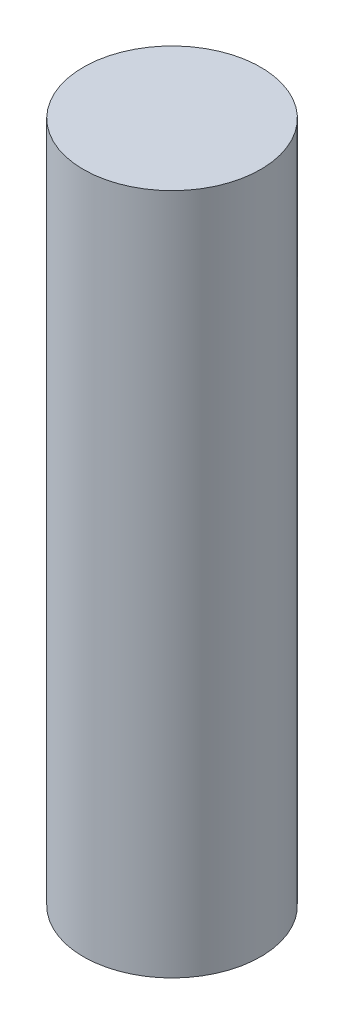
ISO-10303-21;
HEADER;
FILE_DESCRIPTION(('STEP AP214'),'2;1');
FILE_NAME('part.step','',(''),(''),'','','');
FILE_SCHEMA(('AUTOMOTIVE_DESIGN { 1 0 10303 214 1 1 1 1 }'));
ENDSEC;
DATA;
#1=APPLICATION_CONTEXT('core data for automotive mechanical design processes');
#2=APPLICATION_PROTOCOL_DEFINITION('international standard','automotive_design',2000,#1);
#3=PRODUCT_CONTEXT('',#1,'mechanical');
#4=PRODUCT('Part','Part','',(#3));
#5=PRODUCT_RELATED_PRODUCT_CATEGORY('part','',(#4));
#6=PRODUCT_DEFINITION_FORMATION('','',#4);
#7=PRODUCT_DEFINITION_CONTEXT('part definition',#1,'design');
#8=PRODUCT_DEFINITION('design','',#6,#7);
#9=PRODUCT_DEFINITION_SHAPE('','',#8);
#10=(LENGTH_UNIT() NAMED_UNIT(*) SI_UNIT(.MILLI.,.METRE.));
#11=(NAMED_UNIT(*) PLANE_ANGLE_UNIT() SI_UNIT($,.RADIAN.));
#12=(NAMED_UNIT(*) SI_UNIT($,.STERADIAN.) SOLID_ANGLE_UNIT());
#13=UNCERTAINTY_MEASURE_WITH_UNIT(LENGTH_MEASURE(1.E-05),#10,'distance_accuracy_value','');
#14=(GEOMETRIC_REPRESENTATION_CONTEXT(3) GLOBAL_UNCERTAINTY_ASSIGNED_CONTEXT((#13)) GLOBAL_UNIT_ASSIGNED_CONTEXT((#10,
#11,#12)) REPRESENTATION_CONTEXT('',''));
#15=CARTESIAN_POINT('',(0.,0.,0.));
#16=DIRECTION('',(0.,0.,1.));
#17=DIRECTION('',(1.,0.,0.));
#18=AXIS2_PLACEMENT_3D('',#15,#16,#17);
#19=CARTESIAN_POINT('',(0.,20.,0.));
#20=DIRECTION('',(0.,-1.,0.));
#21=DIRECTION('',(0.,0.,-1.));
#22=AXIS2_PLACEMENT_3D('',#19,#20,#21);
#23=CYLINDRICAL_SURFACE('',#22,2.6);
#24=CARTESIAN_POINT('',(0.,20.,0.));
#25=DIRECTION('',(0.,1.,0.));
#26=DIRECTION('',(0.,0.,1.));
#27=AXIS2_PLACEMENT_3D('',#24,#25,#26);
#28=CIRCLE('',#27,2.6);
#29=CARTESIAN_POINT('',(0.,20.,2.6));
#30=VERTEX_POINT('',#29);
#31=EDGE_CURVE('E10',#30,#30,#28,.T.);
#32=ORIENTED_EDGE('',*,*,#31,.F.);
#33=EDGE_LOOP('',(#32));
#34=FACE_BOUND('',#33,.T.);
#35=CARTESIAN_POINT('',(0.,0.,0.));
#36=DIRECTION('',(0.,1.,0.));
#37=DIRECTION('',(0.,0.,1.));
#38=AXIS2_PLACEMENT_3D('',#35,#36,#37);
#39=CIRCLE('',#38,2.6);
#40=CARTESIAN_POINT('',(0.,0.,2.6));
#41=VERTEX_POINT('',#40);
#42=EDGE_CURVE('E33',#41,#41,#39,.T.);
#43=ORIENTED_EDGE('',*,*,#42,.T.);
#44=EDGE_LOOP('',(#43));
#45=FACE_BOUND('',#44,.T.);
#46=ADVANCED_FACE('F30',(#34,#45),#23,.T.);
#47=CARTESIAN_POINT('',(0.,20.,0.));
#48=DIRECTION('',(0.,1.,0.));
#49=DIRECTION('',(0.,0.,1.));
#50=AXIS2_PLACEMENT_3D('',#47,#48,#49);
#51=PLANE('',#50);
#52=ORIENTED_EDGE('',*,*,#31,.T.);
#53=EDGE_LOOP('',(#52));
#54=FACE_BOUND('',#53,.T.);
#55=ADVANCED_FACE('F45',(#54),#51,.T.);
#56=CARTESIAN_POINT('',(0.,0.,0.));
#57=DIRECTION('',(0.,1.,0.));
#58=DIRECTION('',(0.,0.,1.));
#59=AXIS2_PLACEMENT_3D('',#56,#57,#58);
#60=PLANE('',#59);
#61=ORIENTED_EDGE('',*,*,#42,.F.);
#62=EDGE_LOOP('',(#61));
#63=FACE_BOUND('',#62,.T.);
#64=ADVANCED_FACE('F43',(#63),#60,.F.);
#65=CLOSED_SHELL('',(#46,#55,#64));
#66=MANIFOLD_SOLID_BREP('B2',#65);
#67=ADVANCED_BREP_SHAPE_REPRESENTATION('',(#18,#66),#14);
#68=SHAPE_DEFINITION_REPRESENTATION(#9,#67);
ENDSEC;
END-ISO-10303-21;
